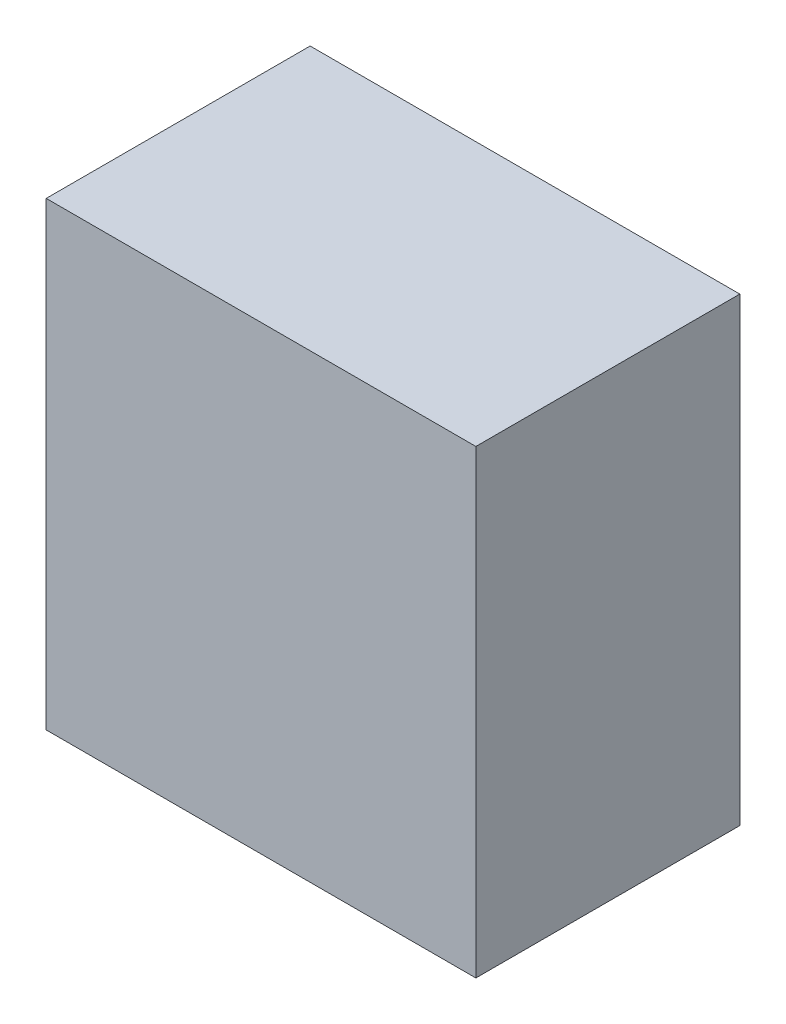
ISO-10303-21;
HEADER;
FILE_DESCRIPTION(('STEP AP214'),'2;1');
FILE_NAME('part.step','',(''),(''),'','','');
FILE_SCHEMA(('AUTOMOTIVE_DESIGN { 1 0 10303 214 1 1 1 1 }'));
ENDSEC;
DATA;
#1=APPLICATION_CONTEXT('core data for automotive mechanical design processes');
#2=APPLICATION_PROTOCOL_DEFINITION('international standard','automotive_design',2000,#1);
#3=PRODUCT_CONTEXT('',#1,'mechanical');
#4=PRODUCT('Part','Part','',(#3));
#5=PRODUCT_RELATED_PRODUCT_CATEGORY('part','',(#4));
#6=PRODUCT_DEFINITION_FORMATION('','',#4);
#7=PRODUCT_DEFINITION_CONTEXT('part definition',#1,'design');
#8=PRODUCT_DEFINITION('design','',#6,#7);
#9=PRODUCT_DEFINITION_SHAPE('','',#8);
#10=(LENGTH_UNIT() NAMED_UNIT(*) SI_UNIT(.MILLI.,.METRE.));
#11=(NAMED_UNIT(*) PLANE_ANGLE_UNIT() SI_UNIT($,.RADIAN.));
#12=(NAMED_UNIT(*) SI_UNIT($,.STERADIAN.) SOLID_ANGLE_UNIT());
#13=UNCERTAINTY_MEASURE_WITH_UNIT(LENGTH_MEASURE(1.E-05),#10,'distance_accuracy_value','');
#14=(GEOMETRIC_REPRESENTATION_CONTEXT(3) GLOBAL_UNCERTAINTY_ASSIGNED_CONTEXT((#13)) GLOBAL_UNIT_ASSIGNED_CONTEXT((#10,
#11,#12)) REPRESENTATION_CONTEXT('',''));
#15=CARTESIAN_POINT('',(0.,0.,0.));
#16=DIRECTION('',(0.,0.,1.));
#17=DIRECTION('',(1.,0.,0.));
#18=AXIS2_PLACEMENT_3D('',#15,#16,#17);
#19=CARTESIAN_POINT('',(140.,0.,0.));
#20=DIRECTION('',(0.,0.,-1.));
#21=DIRECTION('',(-1.,0.,0.));
#22=AXIS2_PLACEMENT_3D('',#19,#20,#21);
#23=PLANE('',#22);
#24=DIRECTION('',(0.,-1.,0.));
#25=VECTOR('',#24,1.);
#26=CARTESIAN_POINT('',(0.,0.,0.));
#27=LINE('',#26,#25);
#28=CARTESIAN_POINT('',(0.,150.,0.));
#29=VERTEX_POINT('',#28);
#30=CARTESIAN_POINT('',(0.,0.,0.));
#31=VERTEX_POINT('',#30);
#32=EDGE_CURVE('E128',#29,#31,#27,.T.);
#33=ORIENTED_EDGE('',*,*,#32,.T.);
#34=DIRECTION('',(-1.,0.,0.));
#35=VECTOR('',#34,1.);
#36=CARTESIAN_POINT('',(140.,0.,0.));
#37=LINE('',#36,#35);
#38=CARTESIAN_POINT('',(140.,0.,0.));
#39=VERTEX_POINT('',#38);
#40=EDGE_CURVE('E11',#39,#31,#37,.T.);
#41=ORIENTED_EDGE('',*,*,#40,.F.);
#42=DIRECTION('',(0.,-1.,0.));
#43=VECTOR('',#42,1.);
#44=CARTESIAN_POINT('',(140.,0.,0.));
#45=LINE('',#44,#43);
#46=CARTESIAN_POINT('',(140.,150.,0.));
#47=VERTEX_POINT('',#46);
#48=EDGE_CURVE('E129',#47,#39,#45,.T.);
#49=ORIENTED_EDGE('',*,*,#48,.F.);
#50=DIRECTION('',(-1.,0.,0.));
#51=VECTOR('',#50,1.);
#52=CARTESIAN_POINT('',(140.,150.,0.));
#53=LINE('',#52,#51);
#54=EDGE_CURVE('E135',#47,#29,#53,.T.);
#55=ORIENTED_EDGE('',*,*,#54,.T.);
#56=EDGE_LOOP('',(#33,#41,#49,#55));
#57=FACE_BOUND('',#56,.T.);
#58=ADVANCED_FACE('F35',(#57),#23,.F.);
#59=CARTESIAN_POINT('',(140.,0.,0.));
#60=DIRECTION('',(0.,1.,0.));
#61=DIRECTION('',(0.,0.,1.));
#62=AXIS2_PLACEMENT_3D('',#59,#60,#61);
#63=PLANE('',#62);
#64=DIRECTION('',(0.,0.,-1.));
#65=VECTOR('',#64,1.);
#66=CARTESIAN_POINT('',(0.,0.,0.));
#67=LINE('',#66,#65);
#68=CARTESIAN_POINT('',(0.,0.,-86.));
#69=VERTEX_POINT('',#68);
#70=EDGE_CURVE('E138',#31,#69,#67,.T.);
#71=ORIENTED_EDGE('',*,*,#70,.T.);
#72=DIRECTION('',(-1.,0.,0.));
#73=VECTOR('',#72,1.);
#74=CARTESIAN_POINT('',(140.,0.,-86.));
#75=LINE('',#74,#73);
#76=CARTESIAN_POINT('',(140.,0.,-86.));
#77=VERTEX_POINT('',#76);
#78=EDGE_CURVE('E43',#77,#69,#75,.T.);
#79=ORIENTED_EDGE('',*,*,#78,.F.);
#80=DIRECTION('',(0.,0.,-1.));
#81=VECTOR('',#80,1.);
#82=CARTESIAN_POINT('',(140.,0.,0.));
#83=LINE('',#82,#81);
#84=EDGE_CURVE('E82',#39,#77,#83,.T.);
#85=ORIENTED_EDGE('',*,*,#84,.F.);
#86=ORIENTED_EDGE('',*,*,#40,.T.);
#87=EDGE_LOOP('',(#71,#79,#85,#86));
#88=FACE_BOUND('',#87,.T.);
#89=ADVANCED_FACE('F161',(#88),#63,.F.);
#90=CARTESIAN_POINT('',(140.,0.,-86.));
#91=DIRECTION('',(0.,0.,1.));
#92=DIRECTION('',(1.,0.,0.));
#93=AXIS2_PLACEMENT_3D('',#90,#91,#92);
#94=PLANE('',#93);
#95=DIRECTION('',(0.,1.,0.));
#96=VECTOR('',#95,1.);
#97=CARTESIAN_POINT('',(0.,0.,-86.));
#98=LINE('',#97,#96);
#99=CARTESIAN_POINT('',(0.,150.,-86.));
#100=VERTEX_POINT('',#99);
#101=EDGE_CURVE('E69',#69,#100,#98,.T.);
#102=ORIENTED_EDGE('',*,*,#101,.T.);
#103=DIRECTION('',(-1.,0.,0.));
#104=VECTOR('',#103,1.);
#105=CARTESIAN_POINT('',(140.,150.,-86.));
#106=LINE('',#105,#104);
#107=CARTESIAN_POINT('',(140.,150.,-86.));
#108=VERTEX_POINT('',#107);
#109=EDGE_CURVE('E143',#108,#100,#106,.T.);
#110=ORIENTED_EDGE('',*,*,#109,.F.);
#111=DIRECTION('',(0.,1.,0.));
#112=VECTOR('',#111,1.);
#113=CARTESIAN_POINT('',(140.,0.,-86.));
#114=LINE('',#113,#112);
#115=EDGE_CURVE('E132',#77,#108,#114,.T.);
#116=ORIENTED_EDGE('',*,*,#115,.F.);
#117=ORIENTED_EDGE('',*,*,#78,.T.);
#118=EDGE_LOOP('',(#102,#110,#116,#117));
#119=FACE_BOUND('',#118,.T.);
#120=ADVANCED_FACE('F145',(#119),#94,.F.);
#121=CARTESIAN_POINT('',(140.,150.,0.));
#122=DIRECTION('',(0.,-1.,0.));
#123=DIRECTION('',(0.,0.,-1.));
#124=AXIS2_PLACEMENT_3D('',#121,#122,#123);
#125=PLANE('',#124);
#126=DIRECTION('',(0.,0.,1.));
#127=VECTOR('',#126,1.);
#128=CARTESIAN_POINT('',(0.,150.,0.));
#129=LINE('',#128,#127);
#130=EDGE_CURVE('E75',#100,#29,#129,.T.);
#131=ORIENTED_EDGE('',*,*,#130,.T.);
#132=ORIENTED_EDGE('',*,*,#54,.F.);
#133=DIRECTION('',(0.,0.,1.));
#134=VECTOR('',#133,1.);
#135=CARTESIAN_POINT('',(140.,150.,0.));
#136=LINE('',#135,#134);
#137=EDGE_CURVE('E51',#108,#47,#136,.T.);
#138=ORIENTED_EDGE('',*,*,#137,.F.);
#139=ORIENTED_EDGE('',*,*,#109,.T.);
#140=EDGE_LOOP('',(#131,#132,#138,#139));
#141=FACE_BOUND('',#140,.T.);
#142=ADVANCED_FACE('F152',(#141),#125,.F.);
#143=CARTESIAN_POINT('',(140.,0.,0.));
#144=DIRECTION('',(-1.,0.,0.));
#145=DIRECTION('',(0.,0.,1.));
#146=AXIS2_PLACEMENT_3D('',#143,#144,#145);
#147=PLANE('',#146);
#148=ORIENTED_EDGE('',*,*,#48,.T.);
#149=ORIENTED_EDGE('',*,*,#84,.T.);
#150=ORIENTED_EDGE('',*,*,#115,.T.);
#151=ORIENTED_EDGE('',*,*,#137,.T.);
#152=EDGE_LOOP('',(#148,#149,#150,#151));
#153=FACE_BOUND('',#152,.T.);
#154=ADVANCED_FACE('F154',(#153),#147,.F.);
#155=CARTESIAN_POINT('',(0.,0.,0.));
#156=DIRECTION('',(-1.,0.,0.));
#157=DIRECTION('',(0.,0.,1.));
#158=AXIS2_PLACEMENT_3D('',#155,#156,#157);
#159=PLANE('',#158);
#160=CARTESIAN_POINT('',(0.,144.,-80.));
#161=DIRECTION('',(-1.,0.,0.));
#162=DIRECTION('',(0.,0.,1.));
#163=AXIS2_PLACEMENT_3D('',#160,#161,#162);
#164=CIRCLE('',#163,1.5);
#165=CARTESIAN_POINT('',(0.,144.,-78.5));
#166=VERTEX_POINT('',#165);
#167=EDGE_CURVE('E106',#166,#166,#164,.T.);
#168=ORIENTED_EDGE('',*,*,#167,.F.);
#169=EDGE_LOOP('',(#168));
#170=FACE_BOUND('',#169,.T.);
#171=CARTESIAN_POINT('',(0.,120.,-6.));
#172=DIRECTION('',(-1.,0.,0.));
#173=DIRECTION('',(0.,0.,1.));
#174=AXIS2_PLACEMENT_3D('',#171,#172,#173);
#175=CIRCLE('',#174,1.49999999999999);
#176=CARTESIAN_POINT('',(0.,120.,-4.50000000000001));
#177=VERTEX_POINT('',#176);
#178=EDGE_CURVE('E105',#177,#177,#175,.T.);
#179=ORIENTED_EDGE('',*,*,#178,.F.);
#180=EDGE_LOOP('',(#179));
#181=FACE_BOUND('',#180,.T.);
#182=CARTESIAN_POINT('',(0.,6.,-16.));
#183=DIRECTION('',(-1.,0.,0.));
#184=DIRECTION('',(0.,0.,1.));
#185=AXIS2_PLACEMENT_3D('',#182,#183,#184);
#186=CIRCLE('',#185,1.49999999999999);
#187=CARTESIAN_POINT('',(0.,6.,-14.5));
#188=VERTEX_POINT('',#187);
#189=EDGE_CURVE('E116',#188,#188,#186,.T.);
#190=ORIENTED_EDGE('',*,*,#189,.F.);
#191=EDGE_LOOP('',(#190));
#192=FACE_BOUND('',#191,.T.);
#193=CARTESIAN_POINT('',(0.,6.,-80.));
#194=DIRECTION('',(-1.,0.,0.));
#195=DIRECTION('',(0.,0.,1.));
#196=AXIS2_PLACEMENT_3D('',#193,#194,#195);
#197=CIRCLE('',#196,1.49999999999999);
#198=CARTESIAN_POINT('',(0.,6.,-78.5));
#199=VERTEX_POINT('',#198);
#200=EDGE_CURVE('E122',#199,#199,#197,.T.);
#201=ORIENTED_EDGE('',*,*,#200,.F.);
#202=EDGE_LOOP('',(#201));
#203=FACE_BOUND('',#202,.T.);
#204=ORIENTED_EDGE('',*,*,#32,.F.);
#205=ORIENTED_EDGE('',*,*,#130,.F.);
#206=ORIENTED_EDGE('',*,*,#101,.F.);
#207=ORIENTED_EDGE('',*,*,#70,.F.);
#208=EDGE_LOOP('',(#204,#205,#206,#207));
#209=FACE_BOUND('',#208,.T.);
#210=ADVANCED_FACE('F148',(#170,#181,#192,#203,#209),#159,.T.);
#211=CARTESIAN_POINT('',(5.,6.,-80.));
#212=DIRECTION('',(-1.,0.,0.));
#213=DIRECTION('',(0.,0.,1.));
#214=AXIS2_PLACEMENT_3D('',#211,#212,#213);
#215=CONICAL_SURFACE('',#214,1.5,1.02974425867665);
#216=CARTESIAN_POINT('',(5.90129092854134,6.,-80.));
#217=VERTEX_POINT('',#216);
#218=VERTEX_LOOP('',#217);
#219=FACE_BOUND('',#218,.T.);
#220=CARTESIAN_POINT('',(5.,6.,-80.));
#221=DIRECTION('',(-1.,0.,0.));
#222=DIRECTION('',(0.,0.,1.));
#223=AXIS2_PLACEMENT_3D('',#220,#221,#222);
#224=CIRCLE('',#223,1.5);
#225=CARTESIAN_POINT('',(5.,6.,-78.5));
#226=VERTEX_POINT('',#225);
#227=EDGE_CURVE('E125',#226,#226,#224,.T.);
#228=ORIENTED_EDGE('',*,*,#227,.T.);
#229=EDGE_LOOP('',(#228));
#230=FACE_BOUND('',#229,.T.);
#231=ADVANCED_FACE('F193',(#219,#230),#215,.F.);
#232=CARTESIAN_POINT('',(0.,6.,-80.));
#233=DIRECTION('',(-1.,0.,0.));
#234=DIRECTION('',(0.,0.,1.));
#235=AXIS2_PLACEMENT_3D('',#232,#233,#234);
#236=CYLINDRICAL_SURFACE('',#235,1.49999999999999);
#237=ORIENTED_EDGE('',*,*,#227,.F.);
#238=EDGE_LOOP('',(#237));
#239=FACE_BOUND('',#238,.T.);
#240=ORIENTED_EDGE('',*,*,#200,.T.);
#241=EDGE_LOOP('',(#240));
#242=FACE_BOUND('',#241,.T.);
#243=ADVANCED_FACE('F202',(#239,#242),#236,.F.);
#244=CARTESIAN_POINT('',(5.,6.,-16.));
#245=DIRECTION('',(-1.,0.,0.));
#246=DIRECTION('',(0.,0.,1.));
#247=AXIS2_PLACEMENT_3D('',#244,#245,#246);
#248=CONICAL_SURFACE('',#247,1.5,1.02974425867665);
#249=CARTESIAN_POINT('',(5.90129092854134,6.,-16.));
#250=VERTEX_POINT('',#249);
#251=VERTEX_LOOP('',#250);
#252=FACE_BOUND('',#251,.T.);
#253=CARTESIAN_POINT('',(5.,6.,-16.));
#254=DIRECTION('',(-1.,0.,0.));
#255=DIRECTION('',(0.,0.,1.));
#256=AXIS2_PLACEMENT_3D('',#253,#254,#255);
#257=CIRCLE('',#256,1.5);
#258=CARTESIAN_POINT('',(5.,6.,-14.5));
#259=VERTEX_POINT('',#258);
#260=EDGE_CURVE('E119',#259,#259,#257,.T.);
#261=ORIENTED_EDGE('',*,*,#260,.T.);
#262=EDGE_LOOP('',(#261));
#263=FACE_BOUND('',#262,.T.);
#264=ADVANCED_FACE('F212',(#252,#263),#248,.F.);
#265=CARTESIAN_POINT('',(0.,6.,-16.));
#266=DIRECTION('',(-1.,0.,0.));
#267=DIRECTION('',(0.,0.,1.));
#268=AXIS2_PLACEMENT_3D('',#265,#266,#267);
#269=CYLINDRICAL_SURFACE('',#268,1.49999999999999);
#270=ORIENTED_EDGE('',*,*,#260,.F.);
#271=EDGE_LOOP('',(#270));
#272=FACE_BOUND('',#271,.T.);
#273=ORIENTED_EDGE('',*,*,#189,.T.);
#274=EDGE_LOOP('',(#273));
#275=FACE_BOUND('',#274,.T.);
#276=ADVANCED_FACE('F222',(#272,#275),#269,.F.);
#277=CARTESIAN_POINT('',(5.,120.,-6.));
#278=DIRECTION('',(-1.,0.,0.));
#279=DIRECTION('',(0.,0.,1.));
#280=AXIS2_PLACEMENT_3D('',#277,#278,#279);
#281=CONICAL_SURFACE('',#280,1.5,1.02974425867665);
#282=CARTESIAN_POINT('',(5.90129092854134,120.,-6.));
#283=VERTEX_POINT('',#282);
#284=VERTEX_LOOP('',#283);
#285=FACE_BOUND('',#284,.T.);
#286=CARTESIAN_POINT('',(5.,120.,-6.));
#287=DIRECTION('',(-1.,0.,0.));
#288=DIRECTION('',(0.,0.,1.));
#289=AXIS2_PLACEMENT_3D('',#286,#287,#288);
#290=CIRCLE('',#289,1.5);
#291=CARTESIAN_POINT('',(5.,120.,-4.5));
#292=VERTEX_POINT('',#291);
#293=EDGE_CURVE('E109',#292,#292,#290,.T.);
#294=ORIENTED_EDGE('',*,*,#293,.T.);
#295=EDGE_LOOP('',(#294));
#296=FACE_BOUND('',#295,.T.);
#297=ADVANCED_FACE('F232',(#285,#296),#281,.F.);
#298=CARTESIAN_POINT('',(0.,120.,-6.));
#299=DIRECTION('',(-1.,0.,0.));
#300=DIRECTION('',(0.,0.,1.));
#301=AXIS2_PLACEMENT_3D('',#298,#299,#300);
#302=CYLINDRICAL_SURFACE('',#301,1.49999999999999);
#303=ORIENTED_EDGE('',*,*,#293,.F.);
#304=EDGE_LOOP('',(#303));
#305=FACE_BOUND('',#304,.T.);
#306=ORIENTED_EDGE('',*,*,#178,.T.);
#307=EDGE_LOOP('',(#306));
#308=FACE_BOUND('',#307,.T.);
#309=ADVANCED_FACE('F99',(#305,#308),#302,.F.);
#310=CARTESIAN_POINT('',(5.,144.,-80.));
#311=DIRECTION('',(-1.,0.,0.));
#312=DIRECTION('',(0.,0.,1.));
#313=AXIS2_PLACEMENT_3D('',#310,#311,#312);
#314=CONICAL_SURFACE('',#313,1.5,1.02974425867665);
#315=CARTESIAN_POINT('',(5.90129092854134,144.,-80.));
#316=VERTEX_POINT('',#315);
#317=VERTEX_LOOP('',#316);
#318=FACE_BOUND('',#317,.T.);
#319=CARTESIAN_POINT('',(5.,144.,-80.));
#320=DIRECTION('',(-1.,0.,0.));
#321=DIRECTION('',(0.,0.,1.));
#322=AXIS2_PLACEMENT_3D('',#319,#320,#321);
#323=CIRCLE('',#322,1.5);
#324=CARTESIAN_POINT('',(5.,144.,-78.5));
#325=VERTEX_POINT('',#324);
#326=EDGE_CURVE('E103',#325,#325,#323,.T.);
#327=ORIENTED_EDGE('',*,*,#326,.T.);
#328=EDGE_LOOP('',(#327));
#329=FACE_BOUND('',#328,.T.);
#330=ADVANCED_FACE('F95',(#318,#329),#314,.F.);
#331=CARTESIAN_POINT('',(0.,144.,-80.));
#332=DIRECTION('',(-1.,0.,0.));
#333=DIRECTION('',(0.,0.,1.));
#334=AXIS2_PLACEMENT_3D('',#331,#332,#333);
#335=CYLINDRICAL_SURFACE('',#334,1.5);
#336=ORIENTED_EDGE('',*,*,#326,.F.);
#337=EDGE_LOOP('',(#336));
#338=FACE_BOUND('',#337,.T.);
#339=ORIENTED_EDGE('',*,*,#167,.T.);
#340=EDGE_LOOP('',(#339));
#341=FACE_BOUND('',#340,.T.);
#342=ADVANCED_FACE('F98',(#338,#341),#335,.F.);
#343=CLOSED_SHELL('',(#58,#89,#120,#142,#154,#210,#231,#243,#264,#276,#297,#309,#330,#342));
#344=MANIFOLD_SOLID_BREP('B2',#343);
#345=ADVANCED_BREP_SHAPE_REPRESENTATION('',(#18,#344),#14);
#346=SHAPE_DEFINITION_REPRESENTATION(#9,#345);
ENDSEC;
END-ISO-10303-21;
